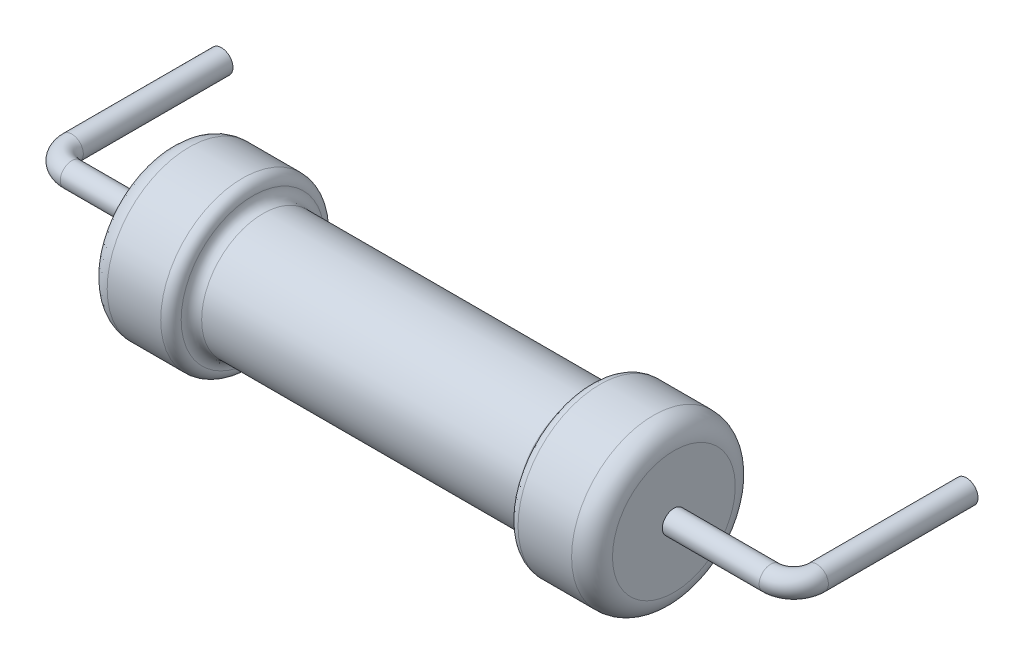
ISO-10303-21;
HEADER;
FILE_DESCRIPTION(('STEP AP214'),'2;1');
FILE_NAME('part.step','',(''),(''),'','','');
FILE_SCHEMA(('AUTOMOTIVE_DESIGN { 1 0 10303 214 1 1 1 1 }'));
ENDSEC;
DATA;
#1=APPLICATION_CONTEXT('core data for automotive mechanical design processes');
#2=APPLICATION_PROTOCOL_DEFINITION('international standard','automotive_design',2000,#1);
#3=PRODUCT_CONTEXT('',#1,'mechanical');
#4=PRODUCT('Part','Part','',(#3));
#5=PRODUCT_RELATED_PRODUCT_CATEGORY('part','',(#4));
#6=PRODUCT_DEFINITION_FORMATION('','',#4);
#7=PRODUCT_DEFINITION_CONTEXT('part definition',#1,'design');
#8=PRODUCT_DEFINITION('design','',#6,#7);
#9=PRODUCT_DEFINITION_SHAPE('','',#8);
#10=(LENGTH_UNIT() NAMED_UNIT(*) SI_UNIT(.MILLI.,.METRE.));
#11=(NAMED_UNIT(*) PLANE_ANGLE_UNIT() SI_UNIT($,.RADIAN.));
#12=(NAMED_UNIT(*) SI_UNIT($,.STERADIAN.) SOLID_ANGLE_UNIT());
#13=UNCERTAINTY_MEASURE_WITH_UNIT(LENGTH_MEASURE(1.E-05),#10,'distance_accuracy_value','');
#14=(GEOMETRIC_REPRESENTATION_CONTEXT(3) GLOBAL_UNCERTAINTY_ASSIGNED_CONTEXT((#13)) GLOBAL_UNIT_ASSIGNED_CONTEXT((#10,
#11,#12)) REPRESENTATION_CONTEXT('',''));
#15=CARTESIAN_POINT('',(0.,0.,0.));
#16=DIRECTION('',(0.,0.,1.));
#17=DIRECTION('',(1.,0.,0.));
#18=AXIS2_PLACEMENT_3D('',#15,#16,#17);
#19=CARTESIAN_POINT('',(-8.454,0.,-2.));
#20=DIRECTION('',(0.,0.,1.));
#21=DIRECTION('',(1.,0.,0.));
#22=AXIS2_PLACEMENT_3D('',#19,#20,#21);
#23=PLANE('',#22);
#24=CARTESIAN_POINT('',(-8.2,0.,-2.));
#25=DIRECTION('',(0.,0.,-1.));
#26=DIRECTION('',(-1.,0.,0.));
#27=AXIS2_PLACEMENT_3D('',#24,#25,#26);
#28=CIRCLE('',#27,0.254);
#29=CARTESIAN_POINT('',(-8.454,0.,-2.));
#30=VERTEX_POINT('',#29);
#31=EDGE_CURVE('P0_E11',#30,#30,#28,.T.);
#32=ORIENTED_EDGE('',*,*,#31,.T.);
#33=EDGE_LOOP('',(#32));
#34=FACE_BOUND('',#33,.T.);
#35=ADVANCED_FACE('P0_F16',(#34),#23,.F.);
#36=CARTESIAN_POINT('',(-8.2,0.,1.2935));
#37=DIRECTION('',(0.,0.,-1.));
#38=DIRECTION('',(-1.,0.,0.));
#39=AXIS2_PLACEMENT_3D('',#36,#37,#38);
#40=CYLINDRICAL_SURFACE('',#39,0.254);
#41=DIRECTION('',(0.,0.,-1.));
#42=VECTOR('',#41,1.);
#43=CARTESIAN_POINT('',(-8.454,0.,1.2935));
#44=LINE('',#43,#42);
#45=CARTESIAN_POINT('',(-8.454,0.,1.2935));
#46=VERTEX_POINT('',#45);
#47=EDGE_CURVE('P0_E20',#46,#30,#44,.T.);
#48=ORIENTED_EDGE('',*,*,#47,.T.);
#49=ORIENTED_EDGE('',*,*,#31,.F.);
#50=ORIENTED_EDGE('',*,*,#47,.F.);
#51=CARTESIAN_POINT('',(-8.2,0.,1.2935));
#52=DIRECTION('',(0.,0.,1.));
#53=DIRECTION('',(-1.,0.,0.));
#54=AXIS2_PLACEMENT_3D('',#51,#52,#53);
#55=CIRCLE('',#54,0.254);
#56=EDGE_CURVE('P0_E69',#46,#46,#55,.T.);
#57=ORIENTED_EDGE('',*,*,#56,.F.);
#58=EDGE_LOOP('',(#48,#49,#50,#57));
#59=FACE_BOUND('',#58,.T.);
#60=ADVANCED_FACE('P0_F77',(#59),#40,.T.);
#61=CARTESIAN_POINT('',(-7.692,0.,1.2935));
#62=DIRECTION('',(0.,-1.,0.));
#63=DIRECTION('',(0.,0.,1.));
#64=AXIS2_PLACEMENT_3D('',#61,#62,#63);
#65=TOROIDAL_SURFACE('',#64,0.508,0.254);
#66=CARTESIAN_POINT('',(-7.692,0.,1.2935));
#67=DIRECTION('',(0.,-1.,0.));
#68=DIRECTION('',(0.,0.,1.));
#69=AXIS2_PLACEMENT_3D('',#66,#67,#68);
#70=CIRCLE('',#69,0.762);
#71=CARTESIAN_POINT('',(-7.692,0.,2.0555));
#72=VERTEX_POINT('',#71);
#73=EDGE_CURVE('P0_E47',#72,#46,#70,.T.);
#74=ORIENTED_EDGE('',*,*,#73,.T.);
#75=ORIENTED_EDGE('',*,*,#56,.T.);
#76=ORIENTED_EDGE('',*,*,#73,.F.);
#77=CARTESIAN_POINT('',(-7.692,0.,1.8015));
#78=DIRECTION('',(-1.,0.,0.));
#79=DIRECTION('',(0.,0.,1.));
#80=AXIS2_PLACEMENT_3D('',#77,#78,#79);
#81=CIRCLE('',#80,0.254);
#82=EDGE_CURVE('P0_E59',#72,#72,#81,.T.);
#83=ORIENTED_EDGE('',*,*,#82,.T.);
#84=EDGE_LOOP('',(#74,#75,#76,#83));
#85=FACE_BOUND('',#84,.T.);
#86=ADVANCED_FACE('P0_F18',(#85),#65,.T.);
#87=CARTESIAN_POINT('',(-5.5615,0.,1.8015));
#88=DIRECTION('',(-1.,0.,0.));
#89=DIRECTION('',(0.,0.,1.));
#90=AXIS2_PLACEMENT_3D('',#87,#88,#89);
#91=CYLINDRICAL_SURFACE('',#90,0.254);
#92=DIRECTION('',(-1.,0.,0.));
#93=VECTOR('',#92,1.);
#94=CARTESIAN_POINT('',(-5.5615,0.,2.0555));
#95=LINE('',#94,#93);
#96=CARTESIAN_POINT('',(-5.5615,0.,2.0555));
#97=VERTEX_POINT('',#96);
#98=EDGE_CURVE('P0_E55',#97,#72,#95,.T.);
#99=ORIENTED_EDGE('',*,*,#98,.T.);
#100=ORIENTED_EDGE('',*,*,#82,.F.);
#101=ORIENTED_EDGE('',*,*,#98,.F.);
#102=CARTESIAN_POINT('',(-5.5615,0.,1.8015));
#103=DIRECTION('',(-1.,0.,0.));
#104=DIRECTION('',(0.,0.,1.));
#105=AXIS2_PLACEMENT_3D('',#102,#103,#104);
#106=CIRCLE('',#105,0.254);
#107=EDGE_CURVE('P0_E58',#97,#97,#106,.T.);
#108=ORIENTED_EDGE('',*,*,#107,.T.);
#109=EDGE_LOOP('',(#99,#100,#101,#108));
#110=FACE_BOUND('',#109,.T.);
#111=ADVANCED_FACE('P0_F56',(#110),#91,.T.);
#112=CARTESIAN_POINT('',(-5.5615,0.,2.0555));
#113=DIRECTION('',(1.,0.,0.));
#114=DIRECTION('',(0.,1.,0.));
#115=AXIS2_PLACEMENT_3D('',#112,#113,#114);
#116=PLANE('',#115);
#117=ORIENTED_EDGE('',*,*,#107,.F.);
#118=EDGE_LOOP('',(#117));
#119=FACE_BOUND('',#118,.T.);
#120=ADVANCED_FACE('P0_F83',(#119),#116,.T.);
#121=CLOSED_SHELL('',(#35,#60,#86,#111,#120));
#122=MANIFOLD_SOLID_BREP('P0_B1',#121);
#123=CARTESIAN_POINT('',(8.454,0.,-2.));
#124=DIRECTION('',(0.,0.,1.));
#125=DIRECTION('',(1.,0.,0.));
#126=AXIS2_PLACEMENT_3D('',#123,#124,#125);
#127=PLANE('',#126);
#128=CARTESIAN_POINT('',(8.2,0.,-2.));
#129=DIRECTION('',(0.,0.,-1.));
#130=DIRECTION('',(1.,0.,0.));
#131=AXIS2_PLACEMENT_3D('',#128,#129,#130);
#132=CIRCLE('',#131,0.254);
#133=CARTESIAN_POINT('',(8.454,0.,-2.));
#134=VERTEX_POINT('',#133);
#135=EDGE_CURVE('P1_E11',#134,#134,#132,.T.);
#136=ORIENTED_EDGE('',*,*,#135,.T.);
#137=EDGE_LOOP('',(#136));
#138=FACE_BOUND('',#137,.T.);
#139=ADVANCED_FACE('P1_F16',(#138),#127,.F.);
#140=CARTESIAN_POINT('',(8.2,0.,1.2935));
#141=DIRECTION('',(0.,0.,-1.));
#142=DIRECTION('',(1.,0.,0.));
#143=AXIS2_PLACEMENT_3D('',#140,#141,#142);
#144=CYLINDRICAL_SURFACE('',#143,0.254);
#145=DIRECTION('',(0.,0.,-1.));
#146=VECTOR('',#145,1.);
#147=CARTESIAN_POINT('',(8.454,0.,1.2935));
#148=LINE('',#147,#146);
#149=CARTESIAN_POINT('',(8.454,0.,1.2935));
#150=VERTEX_POINT('',#149);
#151=EDGE_CURVE('P1_E27',#150,#134,#148,.T.);
#152=ORIENTED_EDGE('',*,*,#151,.T.);
#153=ORIENTED_EDGE('',*,*,#135,.F.);
#154=ORIENTED_EDGE('',*,*,#151,.F.);
#155=CARTESIAN_POINT('',(8.2,0.,1.2935));
#156=DIRECTION('',(0.,0.,1.));
#157=DIRECTION('',(1.,0.,0.));
#158=AXIS2_PLACEMENT_3D('',#155,#156,#157);
#159=CIRCLE('',#158,0.254);
#160=EDGE_CURVE('P1_E69',#150,#150,#159,.T.);
#161=ORIENTED_EDGE('',*,*,#160,.F.);
#162=EDGE_LOOP('',(#152,#153,#154,#161));
#163=FACE_BOUND('',#162,.T.);
#164=ADVANCED_FACE('P1_F80',(#163),#144,.T.);
#165=CARTESIAN_POINT('',(7.692,0.,1.2935));
#166=DIRECTION('',(0.,1.,0.));
#167=DIRECTION('',(0.,0.,1.));
#168=AXIS2_PLACEMENT_3D('',#165,#166,#167);
#169=TOROIDAL_SURFACE('',#168,0.508,0.254);
#170=CARTESIAN_POINT('',(7.692,0.,1.2935));
#171=DIRECTION('',(0.,1.,0.));
#172=DIRECTION('',(0.,0.,1.));
#173=AXIS2_PLACEMENT_3D('',#170,#171,#172);
#174=CIRCLE('',#173,0.762);
#175=CARTESIAN_POINT('',(7.692,0.,2.0555));
#176=VERTEX_POINT('',#175);
#177=EDGE_CURVE('P1_E20',#176,#150,#174,.T.);
#178=ORIENTED_EDGE('',*,*,#177,.T.);
#179=ORIENTED_EDGE('',*,*,#160,.T.);
#180=ORIENTED_EDGE('',*,*,#177,.F.);
#181=CARTESIAN_POINT('',(7.692,0.,1.8015));
#182=DIRECTION('',(1.,0.,0.));
#183=DIRECTION('',(0.,0.,1.));
#184=AXIS2_PLACEMENT_3D('',#181,#182,#183);
#185=CIRCLE('',#184,0.254);
#186=EDGE_CURVE('P1_E57',#176,#176,#185,.T.);
#187=ORIENTED_EDGE('',*,*,#186,.T.);
#188=EDGE_LOOP('',(#178,#179,#180,#187));
#189=FACE_BOUND('',#188,.T.);
#190=ADVANCED_FACE('P1_F78',(#189),#169,.T.);
#191=CARTESIAN_POINT('',(5.5615,0.,1.8015));
#192=DIRECTION('',(1.,0.,0.));
#193=DIRECTION('',(0.,0.,1.));
#194=AXIS2_PLACEMENT_3D('',#191,#192,#193);
#195=CYLINDRICAL_SURFACE('',#194,0.254);
#196=DIRECTION('',(1.,0.,0.));
#197=VECTOR('',#196,1.);
#198=CARTESIAN_POINT('',(5.5615,0.,2.0555));
#199=LINE('',#198,#197);
#200=CARTESIAN_POINT('',(5.5615,0.,2.0555));
#201=VERTEX_POINT('',#200);
#202=EDGE_CURVE('P1_E54',#201,#176,#199,.T.);
#203=ORIENTED_EDGE('',*,*,#202,.T.);
#204=ORIENTED_EDGE('',*,*,#186,.F.);
#205=ORIENTED_EDGE('',*,*,#202,.F.);
#206=CARTESIAN_POINT('',(5.5615,0.,1.8015));
#207=DIRECTION('',(1.,0.,0.));
#208=DIRECTION('',(0.,0.,1.));
#209=AXIS2_PLACEMENT_3D('',#206,#207,#208);
#210=CIRCLE('',#209,0.254);
#211=EDGE_CURVE('P1_E56',#201,#201,#210,.T.);
#212=ORIENTED_EDGE('',*,*,#211,.T.);
#213=EDGE_LOOP('',(#203,#204,#205,#212));
#214=FACE_BOUND('',#213,.T.);
#215=ADVANCED_FACE('P1_F18',(#214),#195,.T.);
#216=CARTESIAN_POINT('',(5.5615,0.,2.0555));
#217=DIRECTION('',(-1.,0.,0.));
#218=DIRECTION('',(0.,0.,1.));
#219=AXIS2_PLACEMENT_3D('',#216,#217,#218);
#220=PLANE('',#219);
#221=ORIENTED_EDGE('',*,*,#211,.F.);
#222=EDGE_LOOP('',(#221));
#223=FACE_BOUND('',#222,.T.);
#224=ADVANCED_FACE('P1_F86',(#223),#220,.T.);
#225=CLOSED_SHELL('',(#139,#164,#190,#215,#224));
#226=MANIFOLD_SOLID_BREP('P1_B1',#225);
#227=CARTESIAN_POINT('',(5.5615,0.,1.8015));
#228=DIRECTION('',(1.,0.,0.));
#229=DIRECTION('',(0.,1.,0.));
#230=AXIS2_PLACEMENT_3D('',#227,#228,#229);
#231=PLANE('',#230);
#232=CARTESIAN_POINT('',(5.5615,0.,1.8015));
#233=DIRECTION('',(1.,0.,0.));
#234=DIRECTION('',(0.,0.,1.));
#235=AXIS2_PLACEMENT_3D('',#232,#233,#234);
#236=CIRCLE('',#235,1.351125);
#237=CARTESIAN_POINT('',(5.5615,0.,3.152625));
#238=VERTEX_POINT('',#237);
#239=EDGE_CURVE('P2_E11',#238,#238,#236,.T.);
#240=ORIENTED_EDGE('',*,*,#239,.T.);
#241=EDGE_LOOP('',(#240));
#242=FACE_BOUND('',#241,.T.);
#243=ADVANCED_FACE('P2_F16',(#242),#231,.T.);
#244=CARTESIAN_POINT('',(5.111125,0.,1.8015));
#245=DIRECTION('',(1.,0.,0.));
#246=DIRECTION('',(0.,0.,1.));
#247=AXIS2_PLACEMENT_3D('',#244,#245,#246);
#248=TOROIDAL_SURFACE('',#247,1.351125,0.450375);
#249=CARTESIAN_POINT('',(5.111125,0.,1.8015));
#250=DIRECTION('',(1.,0.,0.));
#251=DIRECTION('',(0.,0.,1.));
#252=AXIS2_PLACEMENT_3D('',#249,#250,#251);
#253=CIRCLE('',#252,1.8015);
#254=CARTESIAN_POINT('',(5.111125,0.,3.603));
#255=VERTEX_POINT('',#254);
#256=EDGE_CURVE('P2_E119',#255,#255,#253,.T.);
#257=ORIENTED_EDGE('',*,*,#256,.T.);
#258=CARTESIAN_POINT('',(5.111125,0.,3.152625));
#259=DIRECTION('',(0.,1.,0.));
#260=DIRECTION('',(0.,0.,1.));
#261=AXIS2_PLACEMENT_3D('',#258,#259,#260);
#262=CIRCLE('',#261,0.450375);
#263=EDGE_CURVE('P2_E29',#255,#238,#262,.T.);
#264=ORIENTED_EDGE('',*,*,#263,.T.);
#265=ORIENTED_EDGE('',*,*,#239,.F.);
#266=ORIENTED_EDGE('',*,*,#263,.F.);
#267=EDGE_LOOP('',(#257,#264,#265,#266));
#268=FACE_BOUND('',#267,.T.);
#269=ADVANCED_FACE('P2_F165',(#268),#248,.T.);
#270=CARTESIAN_POINT('',(3.932854166667,0.,1.8015));
#271=DIRECTION('',(1.,0.,0.));
#272=DIRECTION('',(0.,0.,1.));
#273=AXIS2_PLACEMENT_3D('',#270,#271,#272);
#274=CYLINDRICAL_SURFACE('',#273,1.8015);
#275=CARTESIAN_POINT('',(3.932854166667,0.,1.8015));
#276=DIRECTION('',(1.,0.,0.));
#277=DIRECTION('',(0.,0.,1.));
#278=AXIS2_PLACEMENT_3D('',#275,#276,#277);
#279=CIRCLE('',#278,1.8015);
#280=CARTESIAN_POINT('',(3.932854166667,0.,3.603));
#281=VERTEX_POINT('',#280);
#282=EDGE_CURVE('P2_E121',#281,#281,#279,.T.);
#283=ORIENTED_EDGE('',*,*,#282,.T.);
#284=DIRECTION('',(1.,0.,0.));
#285=VECTOR('',#284,1.);
#286=CARTESIAN_POINT('',(3.932854166667,0.,3.603));
#287=LINE('',#286,#285);
#288=EDGE_CURVE('P2_E93',#281,#255,#287,.T.);
#289=ORIENTED_EDGE('',*,*,#288,.T.);
#290=ORIENTED_EDGE('',*,*,#256,.F.);
#291=ORIENTED_EDGE('',*,*,#288,.F.);
#292=EDGE_LOOP('',(#283,#289,#290,#291));
#293=FACE_BOUND('',#292,.T.);
#294=ADVANCED_FACE('P2_F142',(#293),#274,.T.);
#295=CARTESIAN_POINT('',(3.707666666667,0.,3.3778125));
#296=CARTESIAN_POINT('',(3.707666666667,0.,3.50972428342311));
#297=CARTESIAN_POINT('',(3.80094238324389,0.,3.603));
#298=CARTESIAN_POINT('',(3.932854166667,0.,3.603));
#299=(BOUNDED_CURVE() B_SPLINE_CURVE(3,(#295,#296,#297,#298),.UNSPECIFIED.,.F.,
.F.) B_SPLINE_CURVE_WITH_KNOTS((4,4),(0.,1.),
.UNSPECIFIED.) CURVE() GEOMETRIC_REPRESENTATION_ITEM() RATIONAL_B_SPLINE_CURVE((1.,
0.804737854124365,0.804737854124365,1.)) REPRESENTATION_ITEM(''));
#300=CARTESIAN_POINT('',(0.,0.,1.8015));
#301=DIRECTION('',(-1.,0.,0.));
#302=AXIS1_PLACEMENT('',#300,#301);
#303=SURFACE_OF_REVOLUTION('',#299,#302);
#304=CARTESIAN_POINT('',(3.707666666667,0.,1.8015));
#305=DIRECTION('',(1.,0.,0.));
#306=DIRECTION('',(0.,0.,1.));
#307=AXIS2_PLACEMENT_3D('',#304,#305,#306);
#308=CIRCLE('',#307,1.5763125);
#309=CARTESIAN_POINT('',(3.707666666667,0.,3.3778125));
#310=VERTEX_POINT('',#309);
#311=EDGE_CURVE('P2_E178',#310,#310,#308,.T.);
#312=ORIENTED_EDGE('',*,*,#311,.T.);
#313=CARTESIAN_POINT('',(3.932854166667,0.,3.3778125));
#314=DIRECTION('',(0.,1.,0.));
#315=DIRECTION('',(-1.,0.,0.));
#316=AXIS2_PLACEMENT_3D('',#313,#314,#315);
#317=CIRCLE('',#316,0.2251875);
#318=EDGE_CURVE('P2_E82',#310,#281,#317,.T.);
#319=ORIENTED_EDGE('',*,*,#318,.T.);
#320=ORIENTED_EDGE('',*,*,#282,.F.);
#321=ORIENTED_EDGE('',*,*,#318,.F.);
#322=EDGE_LOOP('',(#312,#319,#320,#321));
#323=FACE_BOUND('',#322,.T.);
#324=ADVANCED_FACE('P2_F137',(#323),#303,.F.);
#325=CARTESIAN_POINT('',(3.482479166667,0.,3.152625));
#326=CARTESIAN_POINT('',(3.61439095009011,0.,3.152625));
#327=CARTESIAN_POINT('',(3.707666666667,0.,3.24590071657689));
#328=CARTESIAN_POINT('',(3.707666666667,0.,3.3778125));
#329=(BOUNDED_CURVE() B_SPLINE_CURVE(3,(#325,#326,#327,#328),.UNSPECIFIED.,.F.,
.F.) B_SPLINE_CURVE_WITH_KNOTS((4,4),(0.,1.),
.UNSPECIFIED.) CURVE() GEOMETRIC_REPRESENTATION_ITEM() RATIONAL_B_SPLINE_CURVE((1.,
0.804737854124366,0.804737854124366,1.)) REPRESENTATION_ITEM(''));
#330=CARTESIAN_POINT('',(0.,0.,1.8015));
#331=DIRECTION('',(-1.,0.,0.));
#332=AXIS1_PLACEMENT('',#330,#331);
#333=SURFACE_OF_REVOLUTION('',#329,#332);
#334=CARTESIAN_POINT('',(3.482479166667,0.,1.8015));
#335=DIRECTION('',(1.,0.,0.));
#336=DIRECTION('',(0.,0.,1.));
#337=AXIS2_PLACEMENT_3D('',#334,#335,#336);
#338=CIRCLE('',#337,1.351125);
#339=CARTESIAN_POINT('',(3.482479166667,0.,3.152625));
#340=VERTEX_POINT('',#339);
#341=EDGE_CURVE('P2_E198',#340,#340,#338,.T.);
#342=ORIENTED_EDGE('',*,*,#341,.T.);
#343=CARTESIAN_POINT('',(3.482479166667,0.,3.3778125));
#344=DIRECTION('',(0.,-1.,0.));
#345=DIRECTION('',(0.,0.,-1.));
#346=AXIS2_PLACEMENT_3D('',#343,#344,#345);
#347=CIRCLE('',#346,0.2251875);
#348=EDGE_CURVE('P2_E184',#340,#310,#347,.T.);
#349=ORIENTED_EDGE('',*,*,#348,.T.);
#350=ORIENTED_EDGE('',*,*,#311,.F.);
#351=ORIENTED_EDGE('',*,*,#348,.F.);
#352=EDGE_LOOP('',(#342,#349,#350,#351));
#353=FACE_BOUND('',#352,.T.);
#354=ADVANCED_FACE('P2_F141',(#353),#333,.F.);
#355=CARTESIAN_POINT('',(-3.482479166667,0.,1.8015));
#356=DIRECTION('',(1.,0.,0.));
#357=DIRECTION('',(0.,0.,1.));
#358=AXIS2_PLACEMENT_3D('',#355,#356,#357);
#359=CYLINDRICAL_SURFACE('',#358,1.351125);
#360=CARTESIAN_POINT('',(-3.482479166667,0.,1.8015));
#361=DIRECTION('',(1.,0.,0.));
#362=DIRECTION('',(0.,0.,1.));
#363=AXIS2_PLACEMENT_3D('',#360,#361,#362);
#364=CIRCLE('',#363,1.351125);
#365=CARTESIAN_POINT('',(-3.482479166667,0.,3.152625));
#366=VERTEX_POINT('',#365);
#367=EDGE_CURVE('P2_E191',#366,#366,#364,.T.);
#368=ORIENTED_EDGE('',*,*,#367,.T.);
#369=DIRECTION('',(1.,0.,0.));
#370=VECTOR('',#369,1.);
#371=CARTESIAN_POINT('',(-3.482479166667,0.,3.152625));
#372=LINE('',#371,#370);
#373=EDGE_CURVE('P2_E59',#366,#340,#372,.T.);
#374=ORIENTED_EDGE('',*,*,#373,.T.);
#375=ORIENTED_EDGE('',*,*,#341,.F.);
#376=ORIENTED_EDGE('',*,*,#373,.F.);
#377=EDGE_LOOP('',(#368,#374,#375,#376));
#378=FACE_BOUND('',#377,.T.);
#379=ADVANCED_FACE('P2_F146',(#378),#359,.T.);
#380=CARTESIAN_POINT('',(-3.707666666667,0.,3.3778125));
#381=CARTESIAN_POINT('',(-3.707666666667,0.,3.24590071657689));
#382=CARTESIAN_POINT('',(-3.61439095009011,0.,3.152625));
#383=CARTESIAN_POINT('',(-3.482479166667,0.,3.152625));
#384=(BOUNDED_CURVE() B_SPLINE_CURVE(3,(#380,#381,#382,#383),.UNSPECIFIED.,.F.,
.F.) B_SPLINE_CURVE_WITH_KNOTS((4,4),(0.,1.),
.UNSPECIFIED.) CURVE() GEOMETRIC_REPRESENTATION_ITEM() RATIONAL_B_SPLINE_CURVE((1.,
0.804737854124366,0.804737854124366,1.)) REPRESENTATION_ITEM(''));
#385=CARTESIAN_POINT('',(0.,0.,1.8015));
#386=DIRECTION('',(-1.,0.,0.));
#387=AXIS1_PLACEMENT('',#385,#386);
#388=SURFACE_OF_REVOLUTION('',#384,#387);
#389=CARTESIAN_POINT('',(-3.707666666667,0.,1.8015));
#390=DIRECTION('',(1.,0.,0.));
#391=DIRECTION('',(0.,0.,1.));
#392=AXIS2_PLACEMENT_3D('',#389,#390,#391);
#393=CIRCLE('',#392,1.5763125);
#394=CARTESIAN_POINT('',(-3.707666666667,0.,3.3778125));
#395=VERTEX_POINT('',#394);
#396=EDGE_CURVE('P2_E187',#395,#395,#393,.T.);
#397=ORIENTED_EDGE('',*,*,#396,.T.);
#398=CARTESIAN_POINT('',(-3.482479166667,0.,3.3778125));
#399=DIRECTION('',(0.,-1.,0.));
#400=DIRECTION('',(-1.,0.,0.));
#401=AXIS2_PLACEMENT_3D('',#398,#399,#400);
#402=CIRCLE('',#401,0.2251875);
#403=EDGE_CURVE('P2_E73',#395,#366,#402,.T.);
#404=ORIENTED_EDGE('',*,*,#403,.T.);
#405=ORIENTED_EDGE('',*,*,#367,.F.);
#406=ORIENTED_EDGE('',*,*,#403,.F.);
#407=EDGE_LOOP('',(#397,#404,#405,#406));
#408=FACE_BOUND('',#407,.T.);
#409=ADVANCED_FACE('P2_F148',(#408),#388,.F.);
#410=CARTESIAN_POINT('',(-3.932854166667,0.,1.8015));
#411=DIRECTION('',(1.,0.,0.));
#412=DIRECTION('',(0.,0.,1.));
#413=AXIS2_PLACEMENT_3D('',#410,#411,#412);
#414=TOROIDAL_SURFACE('',#413,1.5763125,0.2251875);
#415=CARTESIAN_POINT('',(-3.932854166667,0.,1.8015));
#416=DIRECTION('',(1.,0.,0.));
#417=DIRECTION('',(0.,0.,1.));
#418=AXIS2_PLACEMENT_3D('',#415,#416,#417);
#419=CIRCLE('',#418,1.8015);
#420=CARTESIAN_POINT('',(-3.932854166667,0.,3.603));
#421=VERTEX_POINT('',#420);
#422=EDGE_CURVE('P2_E105',#421,#421,#419,.T.);
#423=ORIENTED_EDGE('',*,*,#422,.T.);
#424=CARTESIAN_POINT('',(-3.932854166667,0.,3.3778125));
#425=DIRECTION('',(0.,1.,0.));
#426=DIRECTION('',(0.,0.,1.));
#427=AXIS2_PLACEMENT_3D('',#424,#425,#426);
#428=CIRCLE('',#427,0.2251875);
#429=EDGE_CURVE('P2_E112',#421,#395,#428,.T.);
#430=ORIENTED_EDGE('',*,*,#429,.T.);
#431=ORIENTED_EDGE('',*,*,#396,.F.);
#432=ORIENTED_EDGE('',*,*,#429,.F.);
#433=EDGE_LOOP('',(#423,#430,#431,#432));
#434=FACE_BOUND('',#433,.T.);
#435=ADVANCED_FACE('P2_F150',(#434),#414,.T.);
#436=CARTESIAN_POINT('',(-5.111125,0.,1.8015));
#437=DIRECTION('',(1.,0.,0.));
#438=DIRECTION('',(0.,0.,1.));
#439=AXIS2_PLACEMENT_3D('',#436,#437,#438);
#440=CYLINDRICAL_SURFACE('',#439,1.8015);
#441=CARTESIAN_POINT('',(-5.111125,0.,1.8015));
#442=DIRECTION('',(1.,0.,0.));
#443=DIRECTION('',(0.,0.,1.));
#444=AXIS2_PLACEMENT_3D('',#441,#442,#443);
#445=CIRCLE('',#444,1.8015);
#446=CARTESIAN_POINT('',(-5.111125,0.,3.603));
#447=VERTEX_POINT('',#446);
#448=EDGE_CURVE('P2_E103',#447,#447,#445,.T.);
#449=ORIENTED_EDGE('',*,*,#448,.T.);
#450=DIRECTION('',(1.,0.,0.));
#451=VECTOR('',#450,1.);
#452=CARTESIAN_POINT('',(-5.111125,0.,3.603));
#453=LINE('',#452,#451);
#454=EDGE_CURVE('P2_E100',#447,#421,#453,.T.);
#455=ORIENTED_EDGE('',*,*,#454,.T.);
#456=ORIENTED_EDGE('',*,*,#422,.F.);
#457=ORIENTED_EDGE('',*,*,#454,.F.);
#458=EDGE_LOOP('',(#449,#455,#456,#457));
#459=FACE_BOUND('',#458,.T.);
#460=ADVANCED_FACE('P2_F101',(#459),#440,.T.);
#461=CARTESIAN_POINT('',(-5.5615,0.,3.152625));
#462=CARTESIAN_POINT('',(-5.5615,0.,3.41644856684622));
#463=CARTESIAN_POINT('',(-5.37494856684622,0.,3.603));
#464=CARTESIAN_POINT('',(-5.111125,0.,3.603));
#465=(BOUNDED_CURVE() B_SPLINE_CURVE(3,(#461,#462,#463,#464),.UNSPECIFIED.,.F.,
.F.) B_SPLINE_CURVE_WITH_KNOTS((4,4),(0.,1.),
.UNSPECIFIED.) CURVE() GEOMETRIC_REPRESENTATION_ITEM() RATIONAL_B_SPLINE_CURVE((1.,
0.804737854124365,0.804737854124365,1.)) REPRESENTATION_ITEM(''));
#466=CARTESIAN_POINT('',(0.,0.,1.8015));
#467=DIRECTION('',(-1.,0.,0.));
#468=AXIS1_PLACEMENT('',#466,#467);
#469=SURFACE_OF_REVOLUTION('',#465,#468);
#470=CARTESIAN_POINT('',(-5.5615,0.,1.8015));
#471=DIRECTION('',(1.,0.,0.));
#472=DIRECTION('',(0.,0.,1.));
#473=AXIS2_PLACEMENT_3D('',#470,#471,#472);
#474=CIRCLE('',#473,1.351125);
#475=CARTESIAN_POINT('',(-5.5615,0.,3.152625));
#476=VERTEX_POINT('',#475);
#477=EDGE_CURVE('P2_E192',#476,#476,#474,.T.);
#478=ORIENTED_EDGE('',*,*,#477,.T.);
#479=CARTESIAN_POINT('',(-5.111125,0.,3.152625));
#480=DIRECTION('',(0.,1.,0.));
#481=DIRECTION('',(-1.,0.,0.));
#482=AXIS2_PLACEMENT_3D('',#479,#480,#481);
#483=CIRCLE('',#482,0.450375);
#484=EDGE_CURVE('P2_E115',#476,#447,#483,.T.);
#485=ORIENTED_EDGE('',*,*,#484,.T.);
#486=ORIENTED_EDGE('',*,*,#448,.F.);
#487=ORIENTED_EDGE('',*,*,#484,.F.);
#488=EDGE_LOOP('',(#478,#485,#486,#487));
#489=FACE_BOUND('',#488,.T.);
#490=ADVANCED_FACE('P2_F18',(#489),#469,.F.);
#491=CARTESIAN_POINT('',(-5.5615,0.,1.8015));
#492=DIRECTION('',(1.,0.,0.));
#493=DIRECTION('',(0.,1.,0.));
#494=AXIS2_PLACEMENT_3D('',#491,#492,#493);
#495=PLANE('',#494);
#496=ORIENTED_EDGE('',*,*,#477,.F.);
#497=EDGE_LOOP('',(#496));
#498=FACE_BOUND('',#497,.T.);
#499=ADVANCED_FACE('P2_F143',(#498),#495,.F.);
#500=CLOSED_SHELL('',(#243,#269,#294,#324,#354,#379,#409,#435,#460,#490,#499));
#501=MANIFOLD_SOLID_BREP('P2_B1',#500);
#502=ADVANCED_BREP_SHAPE_REPRESENTATION('',(#18,#122,#226,#501),#14);
#503=SHAPE_DEFINITION_REPRESENTATION(#9,#502);
ENDSEC;
END-ISO-10303-21;
